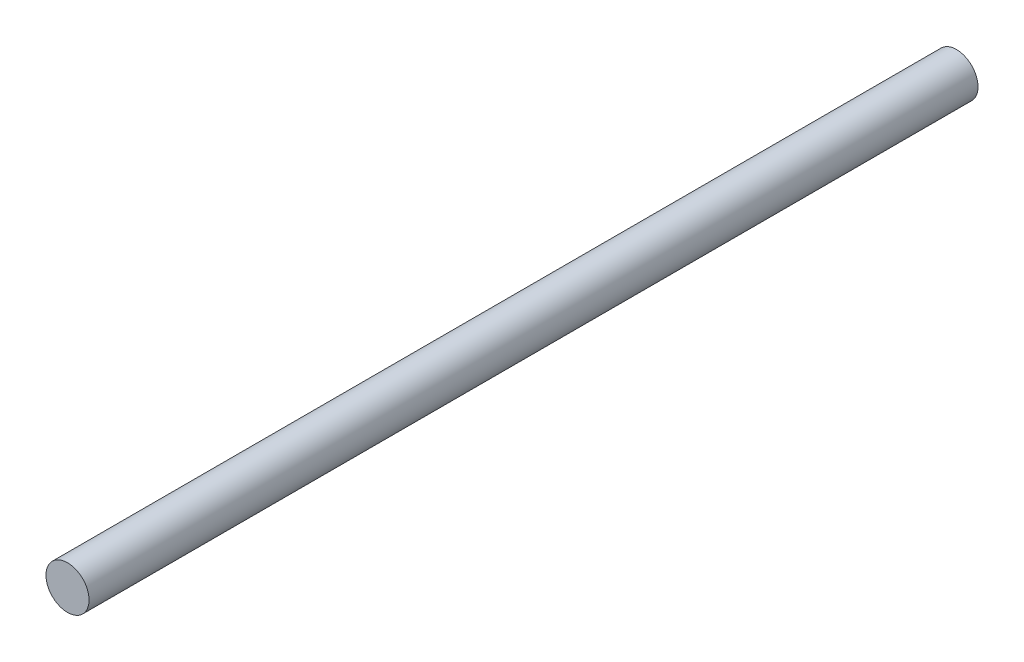
ISO-10303-21;
HEADER;
FILE_DESCRIPTION(('STEP AP214'),'2;1');
FILE_NAME('part.step','',(''),(''),'','','');
FILE_SCHEMA(('AUTOMOTIVE_DESIGN { 1 0 10303 214 1 1 1 1 }'));
ENDSEC;
DATA;
#1=APPLICATION_CONTEXT('core data for automotive mechanical design processes');
#2=APPLICATION_PROTOCOL_DEFINITION('international standard','automotive_design',2000,#1);
#3=PRODUCT_CONTEXT('',#1,'mechanical');
#4=PRODUCT('Part','Part','',(#3));
#5=PRODUCT_RELATED_PRODUCT_CATEGORY('part','',(#4));
#6=PRODUCT_DEFINITION_FORMATION('','',#4);
#7=PRODUCT_DEFINITION_CONTEXT('part definition',#1,'design');
#8=PRODUCT_DEFINITION('design','',#6,#7);
#9=PRODUCT_DEFINITION_SHAPE('','',#8);
#10=(LENGTH_UNIT() NAMED_UNIT(*) SI_UNIT(.MILLI.,.METRE.));
#11=(NAMED_UNIT(*) PLANE_ANGLE_UNIT() SI_UNIT($,.RADIAN.));
#12=(NAMED_UNIT(*) SI_UNIT($,.STERADIAN.) SOLID_ANGLE_UNIT());
#13=UNCERTAINTY_MEASURE_WITH_UNIT(LENGTH_MEASURE(1.E-05),#10,'distance_accuracy_value','');
#14=(GEOMETRIC_REPRESENTATION_CONTEXT(3) GLOBAL_UNCERTAINTY_ASSIGNED_CONTEXT((#13)) GLOBAL_UNIT_ASSIGNED_CONTEXT((#10,
#11,#12)) REPRESENTATION_CONTEXT('',''));
#15=CARTESIAN_POINT('',(0.,0.,0.));
#16=DIRECTION('',(0.,0.,1.));
#17=DIRECTION('',(1.,0.,0.));
#18=AXIS2_PLACEMENT_3D('',#15,#16,#17);
#19=CARTESIAN_POINT('',(0.,0.,165.));
#20=DIRECTION('',(0.,0.,-1.));
#21=DIRECTION('',(-1.,0.,0.));
#22=AXIS2_PLACEMENT_3D('',#19,#20,#21);
#23=CYLINDRICAL_SURFACE('',#22,4.);
#24=CARTESIAN_POINT('',(0.,0.,165.));
#25=DIRECTION('',(0.,0.,1.));
#26=DIRECTION('',(1.,0.,0.));
#27=AXIS2_PLACEMENT_3D('',#24,#25,#26);
#28=CIRCLE('',#27,4.);
#29=CARTESIAN_POINT('',(4.,0.,165.));
#30=VERTEX_POINT('',#29);
#31=EDGE_CURVE('E10',#30,#30,#28,.T.);
#32=ORIENTED_EDGE('',*,*,#31,.F.);
#33=EDGE_LOOP('',(#32));
#34=FACE_BOUND('',#33,.T.);
#35=CARTESIAN_POINT('',(0.,0.,0.));
#36=DIRECTION('',(0.,0.,1.));
#37=DIRECTION('',(1.,0.,0.));
#38=AXIS2_PLACEMENT_3D('',#35,#36,#37);
#39=CIRCLE('',#38,4.);
#40=CARTESIAN_POINT('',(4.,0.,0.));
#41=VERTEX_POINT('',#40);
#42=EDGE_CURVE('E36',#41,#41,#39,.T.);
#43=ORIENTED_EDGE('',*,*,#42,.T.);
#44=EDGE_LOOP('',(#43));
#45=FACE_BOUND('',#44,.T.);
#46=ADVANCED_FACE('F33',(#34,#45),#23,.T.);
#47=CARTESIAN_POINT('',(0.,0.,165.));
#48=DIRECTION('',(0.,0.,1.));
#49=DIRECTION('',(1.,0.,0.));
#50=AXIS2_PLACEMENT_3D('',#47,#48,#49);
#51=PLANE('',#50);
#52=ORIENTED_EDGE('',*,*,#31,.T.);
#53=EDGE_LOOP('',(#52));
#54=FACE_BOUND('',#53,.T.);
#55=ADVANCED_FACE('F50',(#54),#51,.T.);
#56=CARTESIAN_POINT('',(0.,0.,0.));
#57=DIRECTION('',(0.,0.,1.));
#58=DIRECTION('',(1.,0.,0.));
#59=AXIS2_PLACEMENT_3D('',#56,#57,#58);
#60=PLANE('',#59);
#61=ORIENTED_EDGE('',*,*,#42,.F.);
#62=EDGE_LOOP('',(#61));
#63=FACE_BOUND('',#62,.T.);
#64=ADVANCED_FACE('F48',(#63),#60,.F.);
#65=CLOSED_SHELL('',(#46,#55,#64));
#66=MANIFOLD_SOLID_BREP('B2',#65);
#67=ADVANCED_BREP_SHAPE_REPRESENTATION('',(#18,#66),#14);
#68=SHAPE_DEFINITION_REPRESENTATION(#9,#67);
ENDSEC;
END-ISO-10303-21;
